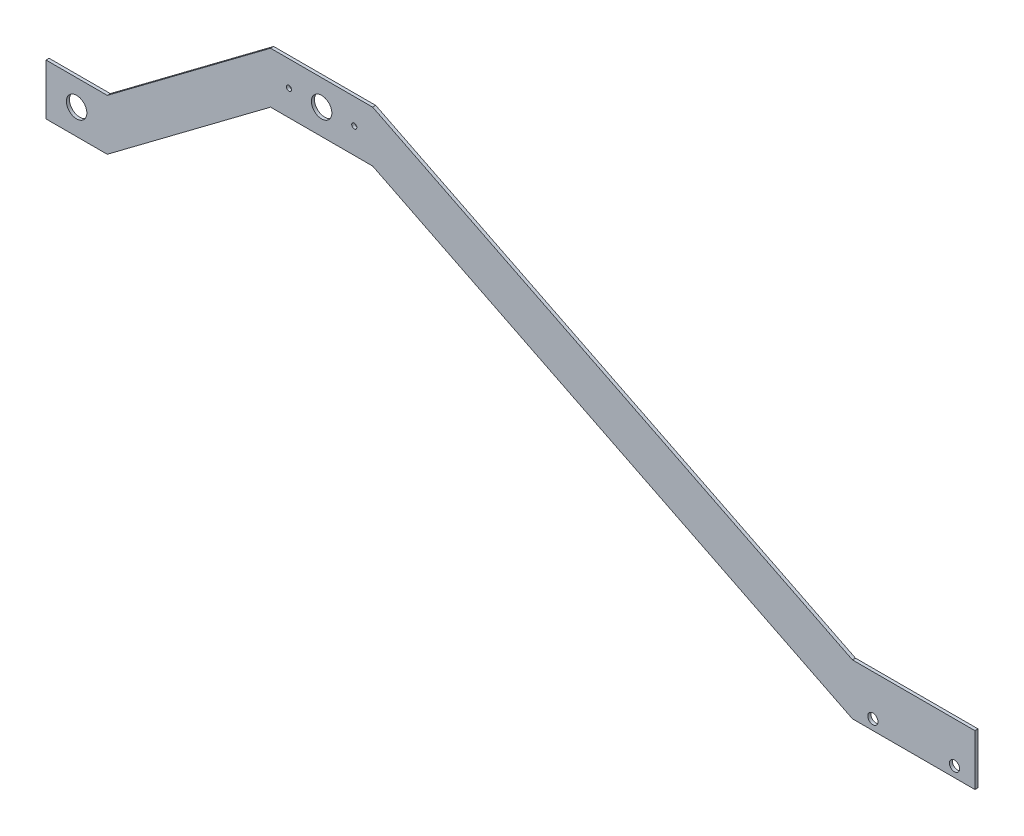
ISO-10303-21;
HEADER;
FILE_DESCRIPTION(('STEP AP214'),'2;1');
FILE_NAME('part.step','',(''),(''),'','','');
FILE_SCHEMA(('AUTOMOTIVE_DESIGN { 1 0 10303 214 1 1 1 1 }'));
ENDSEC;
DATA;
#1=APPLICATION_CONTEXT('core data for automotive mechanical design processes');
#2=APPLICATION_PROTOCOL_DEFINITION('international standard','automotive_design',2000,#1);
#3=PRODUCT_CONTEXT('',#1,'mechanical');
#4=PRODUCT('Part','Part','',(#3));
#5=PRODUCT_RELATED_PRODUCT_CATEGORY('part','',(#4));
#6=PRODUCT_DEFINITION_FORMATION('','',#4);
#7=PRODUCT_DEFINITION_CONTEXT('part definition',#1,'design');
#8=PRODUCT_DEFINITION('design','',#6,#7);
#9=PRODUCT_DEFINITION_SHAPE('','',#8);
#10=(LENGTH_UNIT() NAMED_UNIT(*) SI_UNIT(.MILLI.,.METRE.));
#11=(NAMED_UNIT(*) PLANE_ANGLE_UNIT() SI_UNIT($,.RADIAN.));
#12=(NAMED_UNIT(*) SI_UNIT($,.STERADIAN.) SOLID_ANGLE_UNIT());
#13=UNCERTAINTY_MEASURE_WITH_UNIT(LENGTH_MEASURE(1.E-05),#10,'distance_accuracy_value','');
#14=(GEOMETRIC_REPRESENTATION_CONTEXT(3) GLOBAL_UNCERTAINTY_ASSIGNED_CONTEXT((#13)) GLOBAL_UNIT_ASSIGNED_CONTEXT((#10,
#11,#12)) REPRESENTATION_CONTEXT('',''));
#15=CARTESIAN_POINT('',(0.,0.,0.));
#16=DIRECTION('',(0.,0.,1.));
#17=DIRECTION('',(1.,0.,0.));
#18=AXIS2_PLACEMENT_3D('',#15,#16,#17);
#19=CARTESIAN_POINT('',(-351.08820062678,468.117600835707,3.));
#20=DIRECTION('',(0.6,-0.8,0.));
#21=DIRECTION('',(0.8,0.6,0.));
#22=AXIS2_PLACEMENT_3D('',#19,#20,#21);
#23=PLANE('',#22);
#24=DIRECTION('',(-0.8,-0.6,0.));
#25=VECTOR('',#24,1.);
#26=CARTESIAN_POINT('',(-351.08820062678,468.117600835707,0.));
#27=LINE('',#26,#25);
#28=CARTESIAN_POINT('',(-630.,258.933751305792,0.));
#29=VERTEX_POINT('',#28);
#30=CARTESIAN_POINT('',(-790.,138.933751305792,0.));
#31=VERTEX_POINT('',#30);
#32=EDGE_CURVE('E159',#29,#31,#27,.T.);
#33=ORIENTED_EDGE('',*,*,#32,.T.);
#34=DIRECTION('',(0.,0.,-1.));
#35=VECTOR('',#34,1.);
#36=CARTESIAN_POINT('',(-790.,138.933751305792,3.));
#37=LINE('',#36,#35);
#38=CARTESIAN_POINT('',(-790.,138.933751305792,3.));
#39=VERTEX_POINT('',#38);
#40=EDGE_CURVE('E11',#39,#31,#37,.T.);
#41=ORIENTED_EDGE('',*,*,#40,.F.);
#42=DIRECTION('',(-0.8,-0.6,0.));
#43=VECTOR('',#42,1.);
#44=CARTESIAN_POINT('',(-351.08820062678,468.117600835707,3.));
#45=LINE('',#44,#43);
#46=CARTESIAN_POINT('',(-630.,258.933751305792,3.));
#47=VERTEX_POINT('',#46);
#48=EDGE_CURVE('E188',#47,#39,#45,.T.);
#49=ORIENTED_EDGE('',*,*,#48,.F.);
#50=DIRECTION('',(0.,0.,-1.));
#51=VECTOR('',#50,1.);
#52=CARTESIAN_POINT('',(-630.,258.933751305792,3.));
#53=LINE('',#52,#51);
#54=EDGE_CURVE('E158',#47,#29,#53,.T.);
#55=ORIENTED_EDGE('',*,*,#54,.T.);
#56=EDGE_LOOP('',(#33,#41,#49,#55));
#57=FACE_BOUND('',#56,.T.);
#58=ADVANCED_FACE('F36',(#57),#23,.F.);
#59=CARTESIAN_POINT('',(0.,138.933751305792,3.));
#60=DIRECTION('',(0.,-1.,0.));
#61=DIRECTION('',(1.,0.,0.));
#62=AXIS2_PLACEMENT_3D('',#59,#60,#61);
#63=PLANE('',#62);
#64=DIRECTION('',(-1.,0.,0.));
#65=VECTOR('',#64,1.);
#66=CARTESIAN_POINT('',(0.,138.933751305792,0.));
#67=LINE('',#66,#65);
#68=CARTESIAN_POINT('',(-849.999999999999,138.933751305792,0.));
#69=VERTEX_POINT('',#68);
#70=EDGE_CURVE('E162',#31,#69,#67,.T.);
#71=ORIENTED_EDGE('',*,*,#70,.T.);
#72=DIRECTION('',(0.,0.,-1.));
#73=VECTOR('',#72,1.);
#74=CARTESIAN_POINT('',(-849.999999999999,138.933751305792,3.));
#75=LINE('',#74,#73);
#76=CARTESIAN_POINT('',(-849.999999999999,138.933751305792,3.));
#77=VERTEX_POINT('',#76);
#78=EDGE_CURVE('E45',#77,#69,#75,.T.);
#79=ORIENTED_EDGE('',*,*,#78,.F.);
#80=DIRECTION('',(-1.,0.,0.));
#81=VECTOR('',#80,1.);
#82=CARTESIAN_POINT('',(0.,138.933751305792,3.));
#83=LINE('',#82,#81);
#84=EDGE_CURVE('E108',#39,#77,#83,.T.);
#85=ORIENTED_EDGE('',*,*,#84,.F.);
#86=ORIENTED_EDGE('',*,*,#40,.T.);
#87=EDGE_LOOP('',(#71,#79,#85,#86));
#88=FACE_BOUND('',#87,.T.);
#89=ADVANCED_FACE('F284',(#88),#63,.F.);
#90=CARTESIAN_POINT('',(-849.999999999999,-1.88737914186275E-12,3.));
#91=DIRECTION('',(1.,0.,0.));
#92=DIRECTION('',(0.,1.,0.));
#93=AXIS2_PLACEMENT_3D('',#90,#91,#92);
#94=PLANE('',#93);
#95=DIRECTION('',(0.,-1.,0.));
#96=VECTOR('',#95,1.);
#97=CARTESIAN_POINT('',(-849.999999999999,-1.88737914186275E-12,0.));
#98=LINE('',#97,#96);
#99=CARTESIAN_POINT('',(-849.999999999999,88.933751305792,0.));
#100=VERTEX_POINT('',#99);
#101=EDGE_CURVE('E165',#69,#100,#98,.T.);
#102=ORIENTED_EDGE('',*,*,#101,.T.);
#103=DIRECTION('',(0.,0.,-1.));
#104=VECTOR('',#103,1.);
#105=CARTESIAN_POINT('',(-849.999999999999,88.933751305792,3.));
#106=LINE('',#105,#104);
#107=CARTESIAN_POINT('',(-849.999999999999,88.933751305792,3.));
#108=VERTEX_POINT('',#107);
#109=EDGE_CURVE('E202',#108,#100,#106,.T.);
#110=ORIENTED_EDGE('',*,*,#109,.F.);
#111=DIRECTION('',(0.,-1.,0.));
#112=VECTOR('',#111,1.);
#113=CARTESIAN_POINT('',(-849.999999999999,-1.88737914186275E-12,3.));
#114=LINE('',#113,#112);
#115=EDGE_CURVE('E245',#77,#108,#114,.T.);
#116=ORIENTED_EDGE('',*,*,#115,.F.);
#117=ORIENTED_EDGE('',*,*,#78,.T.);
#118=EDGE_LOOP('',(#102,#110,#116,#117));
#119=FACE_BOUND('',#118,.T.);
#120=ADVANCED_FACE('F288',(#119),#94,.F.);
#121=CARTESIAN_POINT('',(0.,88.933751305792,3.));
#122=DIRECTION('',(0.,1.,0.));
#123=DIRECTION('',(0.,0.,1.));
#124=AXIS2_PLACEMENT_3D('',#121,#122,#123);
#125=PLANE('',#124);
#126=DIRECTION('',(1.,0.,0.));
#127=VECTOR('',#126,1.);
#128=CARTESIAN_POINT('',(0.,88.933751305792,0.));
#129=LINE('',#128,#127);
#130=CARTESIAN_POINT('',(-789.999999999999,88.9337513057918,0.));
#131=VERTEX_POINT('',#130);
#132=EDGE_CURVE('E167',#100,#131,#129,.T.);
#133=ORIENTED_EDGE('',*,*,#132,.T.);
#134=DIRECTION('',(0.,0.,-1.));
#135=VECTOR('',#134,1.);
#136=CARTESIAN_POINT('',(-789.999999999999,88.9337513057918,3.));
#137=LINE('',#136,#135);
#138=CARTESIAN_POINT('',(-789.999999999999,88.9337513057918,3.));
#139=VERTEX_POINT('',#138);
#140=EDGE_CURVE('E200',#139,#131,#137,.T.);
#141=ORIENTED_EDGE('',*,*,#140,.F.);
#142=DIRECTION('',(1.,0.,0.));
#143=VECTOR('',#142,1.);
#144=CARTESIAN_POINT('',(0.,88.933751305792,3.));
#145=LINE('',#144,#143);
#146=EDGE_CURVE('E247',#108,#139,#145,.T.);
#147=ORIENTED_EDGE('',*,*,#146,.F.);
#148=ORIENTED_EDGE('',*,*,#109,.T.);
#149=EDGE_LOOP('',(#133,#141,#147,#148));
#150=FACE_BOUND('',#149,.T.);
#151=ADVANCED_FACE('F292',(#150),#125,.F.);
#152=CARTESIAN_POINT('',(-327.08820062678,436.117600835707,3.));
#153=DIRECTION('',(0.6,-0.8,0.));
#154=DIRECTION('',(0.8,0.6,0.));
#155=AXIS2_PLACEMENT_3D('',#152,#153,#154);
#156=PLANE('',#155);
#157=DIRECTION('',(-0.8,-0.6,0.));
#158=VECTOR('',#157,1.);
#159=CARTESIAN_POINT('',(-327.08820062678,436.117600835707,0.));
#160=LINE('',#159,#158);
#161=CARTESIAN_POINT('',(-629.999999999999,208.933751305792,0.));
#162=VERTEX_POINT('',#161);
#163=EDGE_CURVE('E170',#162,#131,#160,.T.);
#164=ORIENTED_EDGE('',*,*,#163,.F.);
#165=DIRECTION('',(0.,0.,-1.));
#166=VECTOR('',#165,1.);
#167=CARTESIAN_POINT('',(-629.999999999999,208.933751305792,3.));
#168=LINE('',#167,#166);
#169=CARTESIAN_POINT('',(-629.999999999999,208.933751305792,3.));
#170=VERTEX_POINT('',#169);
#171=EDGE_CURVE('E198',#170,#162,#168,.T.);
#172=ORIENTED_EDGE('',*,*,#171,.F.);
#173=DIRECTION('',(-0.8,-0.6,0.));
#174=VECTOR('',#173,1.);
#175=CARTESIAN_POINT('',(-327.08820062678,436.117600835707,3.));
#176=LINE('',#175,#174);
#177=EDGE_CURVE('E249',#170,#139,#176,.T.);
#178=ORIENTED_EDGE('',*,*,#177,.T.);
#179=ORIENTED_EDGE('',*,*,#140,.T.);
#180=EDGE_LOOP('',(#164,#172,#178,#179));
#181=FACE_BOUND('',#180,.T.);
#182=ADVANCED_FACE('F298',(#181),#156,.T.);
#183=CARTESIAN_POINT('',(0.,208.933751305792,3.));
#184=DIRECTION('',(0.,1.,0.));
#185=DIRECTION('',(0.,0.,1.));
#186=AXIS2_PLACEMENT_3D('',#183,#184,#185);
#187=PLANE('',#186);
#188=DIRECTION('',(1.,0.,0.));
#189=VECTOR('',#188,1.);
#190=CARTESIAN_POINT('',(0.,208.933751305792,0.));
#191=LINE('',#190,#189);
#192=CARTESIAN_POINT('',(-530.,208.933751305792,0.));
#193=VERTEX_POINT('',#192);
#194=EDGE_CURVE('E173',#162,#193,#191,.T.);
#195=ORIENTED_EDGE('',*,*,#194,.T.);
#196=DIRECTION('',(0.,0.,-1.));
#197=VECTOR('',#196,1.);
#198=CARTESIAN_POINT('',(-530.,208.933751305792,3.));
#199=LINE('',#198,#197);
#200=CARTESIAN_POINT('',(-530.,208.933751305792,3.));
#201=VERTEX_POINT('',#200);
#202=EDGE_CURVE('E196',#201,#193,#199,.T.);
#203=ORIENTED_EDGE('',*,*,#202,.F.);
#204=DIRECTION('',(1.,0.,0.));
#205=VECTOR('',#204,1.);
#206=CARTESIAN_POINT('',(0.,208.933751305792,3.));
#207=LINE('',#206,#205);
#208=EDGE_CURVE('E252',#170,#201,#207,.T.);
#209=ORIENTED_EDGE('',*,*,#208,.F.);
#210=ORIENTED_EDGE('',*,*,#171,.T.);
#211=EDGE_LOOP('',(#195,#203,#209,#210));
#212=FACE_BOUND('',#211,.T.);
#213=ADVANCED_FACE('F302',(#212),#187,.F.);
#214=CARTESIAN_POINT('',(-21.8856111667775,-43.9707275712411,3.));
#215=DIRECTION('',(-0.445588097725318,-0.895238095238095,0.));
#216=DIRECTION('',(0.895238095238095,-0.445588097725318,0.));
#217=AXIS2_PLACEMENT_3D('',#214,#215,#216);
#218=PLANE('',#217);
#219=DIRECTION('',(-0.895238095238095,0.445588097725318,0.));
#220=VECTOR('',#219,1.);
#221=CARTESIAN_POINT('',(-21.8856111667775,-43.9707275712411,0.));
#222=LINE('',#221,#220);
#223=CARTESIAN_POINT('',(-60.,-25.,0.));
#224=VERTEX_POINT('',#223);
#225=EDGE_CURVE('E176',#224,#193,#222,.T.);
#226=ORIENTED_EDGE('',*,*,#225,.F.);
#227=DIRECTION('',(0.,0.,-1.));
#228=VECTOR('',#227,1.);
#229=CARTESIAN_POINT('',(-60.,-25.,3.));
#230=LINE('',#229,#228);
#231=CARTESIAN_POINT('',(-60.,-25.,3.));
#232=VERTEX_POINT('',#231);
#233=EDGE_CURVE('E194',#232,#224,#230,.T.);
#234=ORIENTED_EDGE('',*,*,#233,.F.);
#235=DIRECTION('',(-0.895238095238095,0.445588097725318,0.));
#236=VECTOR('',#235,1.);
#237=CARTESIAN_POINT('',(-21.8856111667775,-43.9707275712411,3.));
#238=LINE('',#237,#236);
#239=EDGE_CURVE('E254',#232,#201,#238,.T.);
#240=ORIENTED_EDGE('',*,*,#239,.T.);
#241=ORIENTED_EDGE('',*,*,#202,.T.);
#242=EDGE_LOOP('',(#226,#234,#240,#241));
#243=FACE_BOUND('',#242,.T.);
#244=ADVANCED_FACE('F306',(#243),#218,.T.);
#245=CARTESIAN_POINT('',(0.,-25.,3.));
#246=DIRECTION('',(0.,1.,0.));
#247=DIRECTION('',(0.,0.,1.));
#248=AXIS2_PLACEMENT_3D('',#245,#246,#247);
#249=PLANE('',#248);
#250=DIRECTION('',(1.,0.,0.));
#251=VECTOR('',#250,1.);
#252=CARTESIAN_POINT('',(0.,-25.,0.));
#253=LINE('',#252,#251);
#254=CARTESIAN_POINT('',(60.,-25.,0.));
#255=VERTEX_POINT('',#254);
#256=EDGE_CURVE('E179',#224,#255,#253,.T.);
#257=ORIENTED_EDGE('',*,*,#256,.T.);
#258=DIRECTION('',(0.,0.,-1.));
#259=VECTOR('',#258,1.);
#260=CARTESIAN_POINT('',(60.,-25.,3.));
#261=LINE('',#260,#259);
#262=CARTESIAN_POINT('',(60.,-25.,3.));
#263=VERTEX_POINT('',#262);
#264=EDGE_CURVE('E192',#263,#255,#261,.T.);
#265=ORIENTED_EDGE('',*,*,#264,.F.);
#266=DIRECTION('',(1.,0.,0.));
#267=VECTOR('',#266,1.);
#268=CARTESIAN_POINT('',(0.,-25.,3.));
#269=LINE('',#268,#267);
#270=EDGE_CURVE('E153',#232,#263,#269,.T.);
#271=ORIENTED_EDGE('',*,*,#270,.F.);
#272=ORIENTED_EDGE('',*,*,#233,.T.);
#273=EDGE_LOOP('',(#257,#265,#271,#272));
#274=FACE_BOUND('',#273,.T.);
#275=ADVANCED_FACE('F260',(#274),#249,.F.);
#276=CARTESIAN_POINT('',(60.,0.,3.));
#277=DIRECTION('',(1.,0.,0.));
#278=DIRECTION('',(0.,1.,0.));
#279=AXIS2_PLACEMENT_3D('',#276,#277,#278);
#280=PLANE('',#279);
#281=DIRECTION('',(0.,-1.,0.));
#282=VECTOR('',#281,1.);
#283=CARTESIAN_POINT('',(60.,0.,0.));
#284=LINE('',#283,#282);
#285=CARTESIAN_POINT('',(60.,25.,0.));
#286=VERTEX_POINT('',#285);
#287=EDGE_CURVE('E182',#286,#255,#284,.T.);
#288=ORIENTED_EDGE('',*,*,#287,.F.);
#289=DIRECTION('',(0.,0.,-1.));
#290=VECTOR('',#289,1.);
#291=CARTESIAN_POINT('',(60.,25.,3.));
#292=LINE('',#291,#290);
#293=CARTESIAN_POINT('',(60.,25.,3.));
#294=VERTEX_POINT('',#293);
#295=EDGE_CURVE('E142',#294,#286,#292,.T.);
#296=ORIENTED_EDGE('',*,*,#295,.F.);
#297=DIRECTION('',(0.,-1.,0.));
#298=VECTOR('',#297,1.);
#299=CARTESIAN_POINT('',(60.,0.,3.));
#300=LINE('',#299,#298);
#301=EDGE_CURVE('E151',#294,#263,#300,.T.);
#302=ORIENTED_EDGE('',*,*,#301,.T.);
#303=ORIENTED_EDGE('',*,*,#264,.T.);
#304=EDGE_LOOP('',(#288,#296,#302,#303));
#305=FACE_BOUND('',#304,.T.);
#306=ADVANCED_FACE('F264',(#305),#280,.T.);
#307=CARTESIAN_POINT('',(0.,25.,3.));
#308=DIRECTION('',(0.,1.,0.));
#309=DIRECTION('',(0.,0.,1.));
#310=AXIS2_PLACEMENT_3D('',#307,#308,#309);
#311=PLANE('',#310);
#312=DIRECTION('',(1.,0.,0.));
#313=VECTOR('',#312,1.);
#314=CARTESIAN_POINT('',(0.,25.,0.));
#315=LINE('',#314,#313);
#316=CARTESIAN_POINT('',(-60.,25.,0.));
#317=VERTEX_POINT('',#316);
#318=EDGE_CURVE('E141',#317,#286,#315,.T.);
#319=ORIENTED_EDGE('',*,*,#318,.F.);
#320=DIRECTION('',(0.,0.,-1.));
#321=VECTOR('',#320,1.);
#322=CARTESIAN_POINT('',(-60.,25.,3.));
#323=LINE('',#322,#321);
#324=CARTESIAN_POINT('',(-60.,25.,3.));
#325=VERTEX_POINT('',#324);
#326=EDGE_CURVE('E135',#325,#317,#323,.T.);
#327=ORIENTED_EDGE('',*,*,#326,.F.);
#328=DIRECTION('',(1.,0.,0.));
#329=VECTOR('',#328,1.);
#330=CARTESIAN_POINT('',(0.,25.,3.));
#331=LINE('',#330,#329);
#332=EDGE_CURVE('E139',#325,#294,#331,.T.);
#333=ORIENTED_EDGE('',*,*,#332,.T.);
#334=ORIENTED_EDGE('',*,*,#295,.T.);
#335=EDGE_LOOP('',(#319,#327,#333,#334));
#336=FACE_BOUND('',#335,.T.);
#337=ADVANCED_FACE('F137',(#336),#311,.T.);
#338=CARTESIAN_POINT('',(-1.94023917335856,-3.89816521296447,3.));
#339=DIRECTION('',(-0.445588097725318,-0.895238095238095,0.));
#340=DIRECTION('',(0.895238095238095,-0.445588097725318,0.));
#341=AXIS2_PLACEMENT_3D('',#338,#339,#340);
#342=PLANE('',#341);
#343=DIRECTION('',(-0.895238095238095,0.445588097725318,0.));
#344=VECTOR('',#343,1.);
#345=CARTESIAN_POINT('',(-1.94023917335856,-3.89816521296447,0.));
#346=LINE('',#345,#344);
#347=CARTESIAN_POINT('',(-530.,258.933751305792,0.));
#348=VERTEX_POINT('',#347);
#349=EDGE_CURVE('E94',#317,#348,#346,.T.);
#350=ORIENTED_EDGE('',*,*,#349,.T.);
#351=DIRECTION('',(0.,0.,-1.));
#352=VECTOR('',#351,1.);
#353=CARTESIAN_POINT('',(-530.,258.933751305792,3.));
#354=LINE('',#353,#352);
#355=CARTESIAN_POINT('',(-530.,258.933751305792,3.));
#356=VERTEX_POINT('',#355);
#357=EDGE_CURVE('E143',#356,#348,#354,.T.);
#358=ORIENTED_EDGE('',*,*,#357,.F.);
#359=DIRECTION('',(-0.895238095238095,0.445588097725318,0.));
#360=VECTOR('',#359,1.);
#361=CARTESIAN_POINT('',(-1.94023917335856,-3.89816521296447,3.));
#362=LINE('',#361,#360);
#363=EDGE_CURVE('E145',#325,#356,#362,.T.);
#364=ORIENTED_EDGE('',*,*,#363,.F.);
#365=ORIENTED_EDGE('',*,*,#326,.T.);
#366=EDGE_LOOP('',(#350,#358,#364,#365));
#367=FACE_BOUND('',#366,.T.);
#368=ADVANCED_FACE('F146',(#367),#342,.F.);
#369=CARTESIAN_POINT('',(0.,258.933751305792,3.));
#370=DIRECTION('',(0.,-1.,0.));
#371=DIRECTION('',(0.,0.,-1.));
#372=AXIS2_PLACEMENT_3D('',#369,#370,#371);
#373=PLANE('',#372);
#374=DIRECTION('',(-1.,0.,0.));
#375=VECTOR('',#374,1.);
#376=CARTESIAN_POINT('',(0.,258.933751305792,0.));
#377=LINE('',#376,#375);
#378=EDGE_CURVE('E100',#348,#29,#377,.T.);
#379=ORIENTED_EDGE('',*,*,#378,.T.);
#380=ORIENTED_EDGE('',*,*,#54,.F.);
#381=DIRECTION('',(-1.,0.,0.));
#382=VECTOR('',#381,1.);
#383=CARTESIAN_POINT('',(0.,258.933751305792,3.));
#384=LINE('',#383,#382);
#385=EDGE_CURVE('E54',#356,#47,#384,.T.);
#386=ORIENTED_EDGE('',*,*,#385,.F.);
#387=ORIENTED_EDGE('',*,*,#357,.T.);
#388=EDGE_LOOP('',(#379,#380,#386,#387));
#389=FACE_BOUND('',#388,.T.);
#390=ADVANCED_FACE('F272',(#389),#373,.F.);
#391=CARTESIAN_POINT('',(0.,0.,3.));
#392=DIRECTION('',(0.,0.,1.));
#393=DIRECTION('',(1.,0.,0.));
#394=AXIS2_PLACEMENT_3D('',#391,#392,#393);
#395=PLANE('',#394);
#396=CARTESIAN_POINT('',(-548.,233.933751305792,3.));
#397=DIRECTION('',(0.,0.,1.));
#398=DIRECTION('',(1.,0.,0.));
#399=AXIS2_PLACEMENT_3D('',#396,#397,#398);
#400=CIRCLE('',#399,2.49999999999991);
#401=CARTESIAN_POINT('',(-545.5,233.933751305792,3.));
#402=VERTEX_POINT('',#401);
#403=EDGE_CURVE('E208',#402,#402,#400,.T.);
#404=ORIENTED_EDGE('',*,*,#403,.F.);
#405=EDGE_LOOP('',(#404));
#406=FACE_BOUND('',#405,.T.);
#407=CARTESIAN_POINT('',(-612.,233.933751305792,3.));
#408=DIRECTION('',(0.,0.,1.));
#409=DIRECTION('',(1.,0.,0.));
#410=AXIS2_PLACEMENT_3D('',#407,#408,#409);
#411=CIRCLE('',#410,2.49999999999991);
#412=CARTESIAN_POINT('',(-609.5,233.933751305792,3.));
#413=VERTEX_POINT('',#412);
#414=EDGE_CURVE('E214',#413,#413,#411,.T.);
#415=ORIENTED_EDGE('',*,*,#414,.F.);
#416=EDGE_LOOP('',(#415));
#417=FACE_BOUND('',#416,.T.);
#418=CARTESIAN_POINT('',(-819.999999999999,113.933751305792,3.));
#419=DIRECTION('',(0.,0.,1.));
#420=DIRECTION('',(1.,0.,0.));
#421=AXIS2_PLACEMENT_3D('',#418,#419,#420);
#422=CIRCLE('',#421,9.99999999999998);
#423=CARTESIAN_POINT('',(-809.999999999999,113.933751305792,3.));
#424=VERTEX_POINT('',#423);
#425=EDGE_CURVE('E223',#424,#424,#422,.T.);
#426=ORIENTED_EDGE('',*,*,#425,.F.);
#427=EDGE_LOOP('',(#426));
#428=FACE_BOUND('',#427,.T.);
#429=CARTESIAN_POINT('',(-580.,233.933751305792,3.));
#430=DIRECTION('',(0.,0.,1.));
#431=DIRECTION('',(1.,0.,0.));
#432=AXIS2_PLACEMENT_3D('',#429,#430,#431);
#433=CIRCLE('',#432,9.99999999999998);
#434=CARTESIAN_POINT('',(-570.,233.933751305792,3.));
#435=VERTEX_POINT('',#434);
#436=EDGE_CURVE('E229',#435,#435,#433,.T.);
#437=ORIENTED_EDGE('',*,*,#436,.F.);
#438=EDGE_LOOP('',(#437));
#439=FACE_BOUND('',#438,.T.);
#440=CARTESIAN_POINT('',(-40.,-15.,3.));
#441=DIRECTION('',(0.,0.,1.));
#442=DIRECTION('',(1.,0.,0.));
#443=AXIS2_PLACEMENT_3D('',#440,#441,#442);
#444=CIRCLE('',#443,5.);
#445=CARTESIAN_POINT('',(-35.,-15.,3.));
#446=VERTEX_POINT('',#445);
#447=EDGE_CURVE('E235',#446,#446,#444,.T.);
#448=ORIENTED_EDGE('',*,*,#447,.F.);
#449=EDGE_LOOP('',(#448));
#450=FACE_BOUND('',#449,.T.);
#451=CARTESIAN_POINT('',(40.,-15.,3.));
#452=DIRECTION('',(0.,0.,1.));
#453=DIRECTION('',(1.,0.,0.));
#454=AXIS2_PLACEMENT_3D('',#451,#452,#453);
#455=CIRCLE('',#454,5.);
#456=CARTESIAN_POINT('',(45.,-15.,3.));
#457=VERTEX_POINT('',#456);
#458=EDGE_CURVE('E212',#457,#457,#455,.T.);
#459=ORIENTED_EDGE('',*,*,#458,.F.);
#460=EDGE_LOOP('',(#459));
#461=FACE_BOUND('',#460,.T.);
#462=ORIENTED_EDGE('',*,*,#48,.T.);
#463=ORIENTED_EDGE('',*,*,#84,.T.);
#464=ORIENTED_EDGE('',*,*,#115,.T.);
#465=ORIENTED_EDGE('',*,*,#146,.T.);
#466=ORIENTED_EDGE('',*,*,#177,.F.);
#467=ORIENTED_EDGE('',*,*,#208,.T.);
#468=ORIENTED_EDGE('',*,*,#239,.F.);
#469=ORIENTED_EDGE('',*,*,#270,.T.);
#470=ORIENTED_EDGE('',*,*,#301,.F.);
#471=ORIENTED_EDGE('',*,*,#332,.F.);
#472=ORIENTED_EDGE('',*,*,#363,.T.);
#473=ORIENTED_EDGE('',*,*,#385,.T.);
#474=EDGE_LOOP('',(#462,#463,#464,#465,#466,#467,#468,#469,#470,#471,#472,#473));
#475=FACE_BOUND('',#474,.T.);
#476=ADVANCED_FACE('F149',(#406,#417,#428,#439,#450,#461,#475),#395,.T.);
#477=CARTESIAN_POINT('',(0.,0.,0.));
#478=DIRECTION('',(0.,0.,1.));
#479=DIRECTION('',(1.,0.,0.));
#480=AXIS2_PLACEMENT_3D('',#477,#478,#479);
#481=PLANE('',#480);
#482=CARTESIAN_POINT('',(-548.,233.933751305792,0.));
#483=DIRECTION('',(0.,0.,1.));
#484=DIRECTION('',(1.,0.,0.));
#485=AXIS2_PLACEMENT_3D('',#482,#483,#484);
#486=CIRCLE('',#485,2.49999999999991);
#487=CARTESIAN_POINT('',(-545.5,233.933751305792,0.));
#488=VERTEX_POINT('',#487);
#489=EDGE_CURVE('E39',#488,#488,#486,.T.);
#490=ORIENTED_EDGE('',*,*,#489,.T.);
#491=EDGE_LOOP('',(#490));
#492=FACE_BOUND('',#491,.T.);
#493=CARTESIAN_POINT('',(-612.,233.933751305792,0.));
#494=DIRECTION('',(0.,0.,1.));
#495=DIRECTION('',(1.,0.,0.));
#496=AXIS2_PLACEMENT_3D('',#493,#494,#495);
#497=CIRCLE('',#496,2.49999999999991);
#498=CARTESIAN_POINT('',(-609.5,233.933751305792,0.));
#499=VERTEX_POINT('',#498);
#500=EDGE_CURVE('E206',#499,#499,#497,.T.);
#501=ORIENTED_EDGE('',*,*,#500,.T.);
#502=EDGE_LOOP('',(#501));
#503=FACE_BOUND('',#502,.T.);
#504=CARTESIAN_POINT('',(-819.999999999999,113.933751305792,0.));
#505=DIRECTION('',(0.,0.,1.));
#506=DIRECTION('',(1.,0.,0.));
#507=AXIS2_PLACEMENT_3D('',#504,#505,#506);
#508=CIRCLE('',#507,9.99999999999998);
#509=CARTESIAN_POINT('',(-809.999999999999,113.933751305792,0.));
#510=VERTEX_POINT('',#509);
#511=EDGE_CURVE('E163',#510,#510,#508,.T.);
#512=ORIENTED_EDGE('',*,*,#511,.T.);
#513=EDGE_LOOP('',(#512));
#514=FACE_BOUND('',#513,.T.);
#515=CARTESIAN_POINT('',(-580.,233.933751305792,0.));
#516=DIRECTION('',(0.,0.,1.));
#517=DIRECTION('',(1.,0.,0.));
#518=AXIS2_PLACEMENT_3D('',#515,#516,#517);
#519=CIRCLE('',#518,9.99999999999998);
#520=CARTESIAN_POINT('',(-570.,233.933751305792,0.));
#521=VERTEX_POINT('',#520);
#522=EDGE_CURVE('E226',#521,#521,#519,.T.);
#523=ORIENTED_EDGE('',*,*,#522,.T.);
#524=EDGE_LOOP('',(#523));
#525=FACE_BOUND('',#524,.T.);
#526=CARTESIAN_POINT('',(-40.,-15.,0.));
#527=DIRECTION('',(0.,0.,1.));
#528=DIRECTION('',(1.,0.,0.));
#529=AXIS2_PLACEMENT_3D('',#526,#527,#528);
#530=CIRCLE('',#529,5.);
#531=CARTESIAN_POINT('',(-35.,-15.,0.));
#532=VERTEX_POINT('',#531);
#533=EDGE_CURVE('E232',#532,#532,#530,.T.);
#534=ORIENTED_EDGE('',*,*,#533,.T.);
#535=EDGE_LOOP('',(#534));
#536=FACE_BOUND('',#535,.T.);
#537=CARTESIAN_POINT('',(40.,-15.,0.));
#538=DIRECTION('',(0.,0.,1.));
#539=DIRECTION('',(1.,0.,0.));
#540=AXIS2_PLACEMENT_3D('',#537,#538,#539);
#541=CIRCLE('',#540,5.);
#542=CARTESIAN_POINT('',(45.,-15.,0.));
#543=VERTEX_POINT('',#542);
#544=EDGE_CURVE('E238',#543,#543,#541,.T.);
#545=ORIENTED_EDGE('',*,*,#544,.T.);
#546=EDGE_LOOP('',(#545));
#547=FACE_BOUND('',#546,.T.);
#548=ORIENTED_EDGE('',*,*,#32,.F.);
#549=ORIENTED_EDGE('',*,*,#378,.F.);
#550=ORIENTED_EDGE('',*,*,#349,.F.);
#551=ORIENTED_EDGE('',*,*,#318,.T.);
#552=ORIENTED_EDGE('',*,*,#287,.T.);
#553=ORIENTED_EDGE('',*,*,#256,.F.);
#554=ORIENTED_EDGE('',*,*,#225,.T.);
#555=ORIENTED_EDGE('',*,*,#194,.F.);
#556=ORIENTED_EDGE('',*,*,#163,.T.);
#557=ORIENTED_EDGE('',*,*,#132,.F.);
#558=ORIENTED_EDGE('',*,*,#101,.F.);
#559=ORIENTED_EDGE('',*,*,#70,.F.);
#560=EDGE_LOOP('',(#548,#549,#550,#551,#552,#553,#554,#555,#556,#557,#558,#559));
#561=FACE_BOUND('',#560,.T.);
#562=ADVANCED_FACE('F267',(#492,#503,#514,#525,#536,#547,#561),#481,.F.);
#563=CARTESIAN_POINT('',(40.,-15.,0.));
#564=DIRECTION('',(0.,0.,1.));
#565=DIRECTION('',(1.,0.,0.));
#566=AXIS2_PLACEMENT_3D('',#563,#564,#565);
#567=CYLINDRICAL_SURFACE('',#566,5.);
#568=ORIENTED_EDGE('',*,*,#544,.F.);
#569=EDGE_LOOP('',(#568));
#570=FACE_BOUND('',#569,.T.);
#571=ORIENTED_EDGE('',*,*,#458,.T.);
#572=EDGE_LOOP('',(#571));
#573=FACE_BOUND('',#572,.T.);
#574=ADVANCED_FACE('F334',(#570,#573),#567,.F.);
#575=CARTESIAN_POINT('',(-40.,-15.,0.));
#576=DIRECTION('',(0.,0.,1.));
#577=DIRECTION('',(1.,0.,0.));
#578=AXIS2_PLACEMENT_3D('',#575,#576,#577);
#579=CYLINDRICAL_SURFACE('',#578,5.);
#580=ORIENTED_EDGE('',*,*,#533,.F.);
#581=EDGE_LOOP('',(#580));
#582=FACE_BOUND('',#581,.T.);
#583=ORIENTED_EDGE('',*,*,#447,.T.);
#584=EDGE_LOOP('',(#583));
#585=FACE_BOUND('',#584,.T.);
#586=ADVANCED_FACE('F339',(#582,#585),#579,.F.);
#587=CARTESIAN_POINT('',(-580.,233.933751305792,0.));
#588=DIRECTION('',(0.,0.,1.));
#589=DIRECTION('',(1.,0.,0.));
#590=AXIS2_PLACEMENT_3D('',#587,#588,#589);
#591=CYLINDRICAL_SURFACE('',#590,9.99999999999998);
#592=ORIENTED_EDGE('',*,*,#522,.F.);
#593=EDGE_LOOP('',(#592));
#594=FACE_BOUND('',#593,.T.);
#595=ORIENTED_EDGE('',*,*,#436,.T.);
#596=EDGE_LOOP('',(#595));
#597=FACE_BOUND('',#596,.T.);
#598=ADVANCED_FACE('F351',(#594,#597),#591,.F.);
#599=CARTESIAN_POINT('',(-819.999999999999,113.933751305792,0.));
#600=DIRECTION('',(0.,0.,1.));
#601=DIRECTION('',(1.,0.,0.));
#602=AXIS2_PLACEMENT_3D('',#599,#600,#601);
#603=CYLINDRICAL_SURFACE('',#602,9.99999999999998);
#604=ORIENTED_EDGE('',*,*,#511,.F.);
#605=EDGE_LOOP('',(#604));
#606=FACE_BOUND('',#605,.T.);
#607=ORIENTED_EDGE('',*,*,#425,.T.);
#608=EDGE_LOOP('',(#607));
#609=FACE_BOUND('',#608,.T.);
#610=ADVANCED_FACE('F361',(#606,#609),#603,.F.);
#611=CARTESIAN_POINT('',(-612.,233.933751305792,-7.));
#612=DIRECTION('',(0.,0.,1.));
#613=DIRECTION('',(1.,0.,0.));
#614=AXIS2_PLACEMENT_3D('',#611,#612,#613);
#615=CYLINDRICAL_SURFACE('',#614,2.49999999999991);
#616=ORIENTED_EDGE('',*,*,#414,.T.);
#617=EDGE_LOOP('',(#616));
#618=FACE_BOUND('',#617,.T.);
#619=ORIENTED_EDGE('',*,*,#500,.F.);
#620=EDGE_LOOP('',(#619));
#621=FACE_BOUND('',#620,.T.);
#622=ADVANCED_FACE('F371',(#618,#621),#615,.F.);
#623=CARTESIAN_POINT('',(-548.,233.933751305792,-7.));
#624=DIRECTION('',(0.,0.,1.));
#625=DIRECTION('',(1.,0.,0.));
#626=AXIS2_PLACEMENT_3D('',#623,#624,#625);
#627=CYLINDRICAL_SURFACE('',#626,2.49999999999991);
#628=ORIENTED_EDGE('',*,*,#403,.T.);
#629=EDGE_LOOP('',(#628));
#630=FACE_BOUND('',#629,.T.);
#631=ORIENTED_EDGE('',*,*,#489,.F.);
#632=EDGE_LOOP('',(#631));
#633=FACE_BOUND('',#632,.T.);
#634=ADVANCED_FACE('F394',(#630,#633),#627,.F.);
#635=CLOSED_SHELL('',(#58,#89,#120,#151,#182,#213,#244,#275,#306,#337,#368,#390,#476,#562,#574,
#586,#598,#610,#622,#634));
#636=MANIFOLD_SOLID_BREP('B2',#635);
#637=ADVANCED_BREP_SHAPE_REPRESENTATION('',(#18,#636),#14);
#638=SHAPE_DEFINITION_REPRESENTATION(#9,#637);
ENDSEC;
END-ISO-10303-21;
